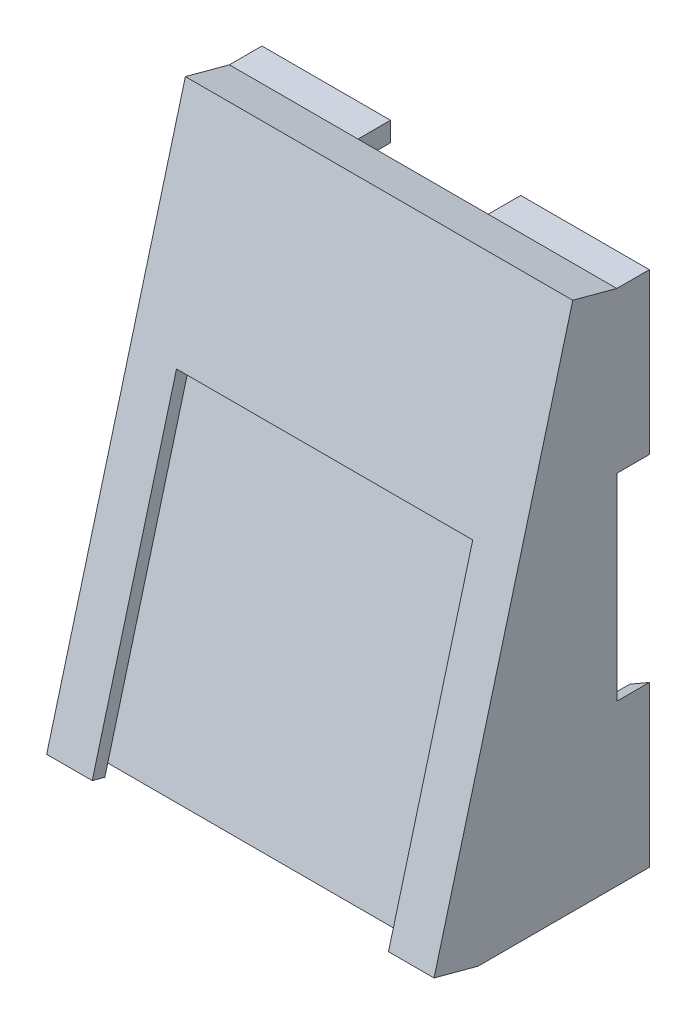
ISO-10303-21;
HEADER;
FILE_DESCRIPTION(('STEP AP214'),'2;1');
FILE_NAME('part.step','',(''),(''),'','','');
FILE_SCHEMA(('AUTOMOTIVE_DESIGN { 1 0 10303 214 1 1 1 1 }'));
ENDSEC;
DATA;
#1=APPLICATION_CONTEXT('core data for automotive mechanical design processes');
#2=APPLICATION_PROTOCOL_DEFINITION('international standard','automotive_design',2000,#1);
#3=PRODUCT_CONTEXT('',#1,'mechanical');
#4=PRODUCT('Part','Part','',(#3));
#5=PRODUCT_RELATED_PRODUCT_CATEGORY('part','',(#4));
#6=PRODUCT_DEFINITION_FORMATION('','',#4);
#7=PRODUCT_DEFINITION_CONTEXT('part definition',#1,'design');
#8=PRODUCT_DEFINITION('design','',#6,#7);
#9=PRODUCT_DEFINITION_SHAPE('','',#8);
#10=(LENGTH_UNIT() NAMED_UNIT(*) SI_UNIT(.MILLI.,.METRE.));
#11=(NAMED_UNIT(*) PLANE_ANGLE_UNIT() SI_UNIT($,.RADIAN.));
#12=(NAMED_UNIT(*) SI_UNIT($,.STERADIAN.) SOLID_ANGLE_UNIT());
#13=UNCERTAINTY_MEASURE_WITH_UNIT(LENGTH_MEASURE(1.E-05),#10,'distance_accuracy_value','');
#14=(GEOMETRIC_REPRESENTATION_CONTEXT(3) GLOBAL_UNCERTAINTY_ASSIGNED_CONTEXT((#13)) GLOBAL_UNIT_ASSIGNED_CONTEXT((#10,
#11,#12)) REPRESENTATION_CONTEXT('',''));
#15=CARTESIAN_POINT('',(0.,0.,0.));
#16=DIRECTION('',(0.,0.,1.));
#17=DIRECTION('',(1.,0.,0.));
#18=AXIS2_PLACEMENT_3D('',#15,#16,#17);
#19=CARTESIAN_POINT('',(59.5,0.,-2.5));
#20=DIRECTION('',(0.,0.,1.));
#21=DIRECTION('',(1.,0.,0.));
#22=AXIS2_PLACEMENT_3D('',#19,#20,#21);
#23=PLANE('',#22);
#24=DIRECTION('',(0.,-1.,0.));
#25=VECTOR('',#24,1.);
#26=CARTESIAN_POINT('',(19.75,0.,-2.5));
#27=LINE('',#26,#25);
#28=CARTESIAN_POINT('',(19.75,-36.75,-2.5));
#29=VERTEX_POINT('',#28);
#30=CARTESIAN_POINT('',(19.75,-39.75,-2.5));
#31=VERTEX_POINT('',#30);
#32=EDGE_CURVE('E276',#29,#31,#27,.T.);
#33=ORIENTED_EDGE('',*,*,#32,.T.);
#34=DIRECTION('',(-1.,0.,0.));
#35=VECTOR('',#34,1.);
#36=CARTESIAN_POINT('',(59.5,-39.75,-2.5));
#37=LINE('',#36,#35);
#38=CARTESIAN_POINT('',(0.,-39.75,-2.5));
#39=VERTEX_POINT('',#38);
#40=EDGE_CURVE('E465',#31,#39,#37,.T.);
#41=ORIENTED_EDGE('',*,*,#40,.T.);
#42=DIRECTION('',(0.,1.,0.));
#43=VECTOR('',#42,1.);
#44=CARTESIAN_POINT('',(0.,0.,-2.5));
#45=LINE('',#44,#43);
#46=CARTESIAN_POINT('',(0.,-15.1554445662277,-2.5));
#47=VERTEX_POINT('',#46);
#48=EDGE_CURVE('E461',#39,#47,#45,.T.);
#49=ORIENTED_EDGE('',*,*,#48,.T.);
#50=DIRECTION('',(0.866025403784439,-0.5,0.));
#51=VECTOR('',#50,1.);
#52=CARTESIAN_POINT('',(-26.25,0.,-2.5));
#53=LINE('',#52,#51);
#54=CARTESIAN_POINT('',(3.,-16.8874953737966,-2.5));
#55=VERTEX_POINT('',#54);
#56=EDGE_CURVE('E297',#47,#55,#53,.T.);
#57=ORIENTED_EDGE('',*,*,#56,.T.);
#58=DIRECTION('',(0.,-1.,0.));
#59=VECTOR('',#58,1.);
#60=CARTESIAN_POINT('',(3.,0.,-2.5));
#61=LINE('',#60,#59);
#62=CARTESIAN_POINT('',(3.,-36.75,-2.5));
#63=VERTEX_POINT('',#62);
#64=EDGE_CURVE('E48',#55,#63,#61,.T.);
#65=ORIENTED_EDGE('',*,*,#64,.T.);
#66=DIRECTION('',(1.,0.,0.));
#67=VECTOR('',#66,1.);
#68=CARTESIAN_POINT('',(59.5,-36.75,-2.5));
#69=LINE('',#68,#67);
#70=EDGE_CURVE('E510',#63,#29,#69,.T.);
#71=ORIENTED_EDGE('',*,*,#70,.T.);
#72=EDGE_LOOP('',(#33,#41,#49,#57,#65,#71));
#73=FACE_BOUND('',#72,.T.);
#74=ADVANCED_FACE('F41',(#73),#23,.F.);
#75=DIRECTION('',(0.,-1.,0.));
#76=VECTOR('',#75,1.);
#77=CARTESIAN_POINT('',(19.75,0.,-2.5));
#78=LINE('',#77,#76);
#79=CARTESIAN_POINT('',(19.75,39.75,-2.5));
#80=VERTEX_POINT('',#79);
#81=CARTESIAN_POINT('',(19.75,36.75,-2.5));
#82=VERTEX_POINT('',#81);
#83=EDGE_CURVE('E301',#80,#82,#78,.T.);
#84=ORIENTED_EDGE('',*,*,#83,.T.);
#85=DIRECTION('',(-1.,0.,0.));
#86=VECTOR('',#85,1.);
#87=CARTESIAN_POINT('',(59.5,36.75,-2.5));
#88=LINE('',#87,#86);
#89=CARTESIAN_POINT('',(3.,36.75,-2.5));
#90=VERTEX_POINT('',#89);
#91=EDGE_CURVE('E502',#82,#90,#88,.T.);
#92=ORIENTED_EDGE('',*,*,#91,.T.);
#93=CARTESIAN_POINT('',(3.,16.8874953737966,-2.5));
#94=VERTEX_POINT('',#93);
#95=EDGE_CURVE('E11',#90,#94,#61,.T.);
#96=ORIENTED_EDGE('',*,*,#95,.T.);
#97=DIRECTION('',(-0.866025403784439,-0.5,0.));
#98=VECTOR('',#97,1.);
#99=CARTESIAN_POINT('',(3.,16.8874953737966,-2.5));
#100=LINE('',#99,#98);
#101=CARTESIAN_POINT('',(0.,15.1554445662277,-2.5));
#102=VERTEX_POINT('',#101);
#103=EDGE_CURVE('E318',#94,#102,#100,.T.);
#104=ORIENTED_EDGE('',*,*,#103,.T.);
#105=CARTESIAN_POINT('',(0.,39.75,-2.5));
#106=VERTEX_POINT('',#105);
#107=EDGE_CURVE('E440',#102,#106,#45,.T.);
#108=ORIENTED_EDGE('',*,*,#107,.T.);
#109=DIRECTION('',(-1.,0.,0.));
#110=VECTOR('',#109,1.);
#111=CARTESIAN_POINT('',(59.5,39.75,-2.5));
#112=LINE('',#111,#110);
#113=EDGE_CURVE('E496',#80,#106,#112,.T.);
#114=ORIENTED_EDGE('',*,*,#113,.F.);
#115=EDGE_LOOP('',(#84,#92,#96,#104,#108,#114));
#116=FACE_BOUND('',#115,.T.);
#117=ADVANCED_FACE('F585',(#116),#23,.F.);
#118=CARTESIAN_POINT('',(56.5,36.75,-2.5));
#119=VERTEX_POINT('',#118);
#120=CARTESIAN_POINT('',(39.75,36.75,-2.5));
#121=VERTEX_POINT('',#120);
#122=EDGE_CURVE('E504',#119,#121,#88,.T.);
#123=ORIENTED_EDGE('',*,*,#122,.T.);
#124=DIRECTION('',(0.,-1.,0.));
#125=VECTOR('',#124,1.);
#126=CARTESIAN_POINT('',(39.75,0.,-2.5));
#127=LINE('',#126,#125);
#128=CARTESIAN_POINT('',(39.75,39.75,-2.5));
#129=VERTEX_POINT('',#128);
#130=EDGE_CURVE('E302',#129,#121,#127,.T.);
#131=ORIENTED_EDGE('',*,*,#130,.F.);
#132=CARTESIAN_POINT('',(59.5,39.75,-2.5));
#133=VERTEX_POINT('',#132);
#134=EDGE_CURVE('E500',#133,#129,#112,.T.);
#135=ORIENTED_EDGE('',*,*,#134,.F.);
#136=DIRECTION('',(0.,1.,0.));
#137=VECTOR('',#136,1.);
#138=CARTESIAN_POINT('',(59.5,0.,-2.5));
#139=LINE('',#138,#137);
#140=CARTESIAN_POINT('',(59.5,15.1554445662277,-2.5));
#141=VERTEX_POINT('',#140);
#142=EDGE_CURVE('E449',#141,#133,#139,.T.);
#143=ORIENTED_EDGE('',*,*,#142,.F.);
#144=DIRECTION('',(0.866025403784439,-0.5,0.));
#145=VECTOR('',#144,1.);
#146=CARTESIAN_POINT('',(56.5,16.8874953737965,-2.5));
#147=LINE('',#146,#145);
#148=CARTESIAN_POINT('',(56.5,16.8874953737965,-2.5));
#149=VERTEX_POINT('',#148);
#150=EDGE_CURVE('E316',#149,#141,#147,.T.);
#151=ORIENTED_EDGE('',*,*,#150,.F.);
#152=DIRECTION('',(0.,-1.,0.));
#153=VECTOR('',#152,1.);
#154=CARTESIAN_POINT('',(56.5,0.,-2.5));
#155=LINE('',#154,#153);
#156=EDGE_CURVE('E501',#119,#149,#155,.T.);
#157=ORIENTED_EDGE('',*,*,#156,.F.);
#158=EDGE_LOOP('',(#123,#131,#135,#143,#151,#157));
#159=FACE_BOUND('',#158,.T.);
#160=ADVANCED_FACE('F539',(#159),#23,.F.);
#161=CARTESIAN_POINT('',(59.5,-39.75,-2.5));
#162=VERTEX_POINT('',#161);
#163=CARTESIAN_POINT('',(39.75,-39.75,-2.5));
#164=VERTEX_POINT('',#163);
#165=EDGE_CURVE('E483',#162,#164,#37,.T.);
#166=ORIENTED_EDGE('',*,*,#165,.T.);
#167=DIRECTION('',(0.,-1.,0.));
#168=VECTOR('',#167,1.);
#169=CARTESIAN_POINT('',(39.75,0.,-2.5));
#170=LINE('',#169,#168);
#171=CARTESIAN_POINT('',(39.75,-36.75,-2.5));
#172=VERTEX_POINT('',#171);
#173=EDGE_CURVE('E310',#172,#164,#170,.T.);
#174=ORIENTED_EDGE('',*,*,#173,.F.);
#175=CARTESIAN_POINT('',(56.5,-36.75,-2.5));
#176=VERTEX_POINT('',#175);
#177=EDGE_CURVE('E282',#172,#176,#69,.T.);
#178=ORIENTED_EDGE('',*,*,#177,.T.);
#179=CARTESIAN_POINT('',(56.5,-16.8874953737966,-2.5));
#180=VERTEX_POINT('',#179);
#181=EDGE_CURVE('E499',#180,#176,#155,.T.);
#182=ORIENTED_EDGE('',*,*,#181,.F.);
#183=DIRECTION('',(-0.866025403784439,-0.5,0.));
#184=VECTOR('',#183,1.);
#185=CARTESIAN_POINT('',(85.75,0.,-2.5));
#186=LINE('',#185,#184);
#187=CARTESIAN_POINT('',(59.5,-15.1554445662277,-2.5));
#188=VERTEX_POINT('',#187);
#189=EDGE_CURVE('E336',#188,#180,#186,.T.);
#190=ORIENTED_EDGE('',*,*,#189,.F.);
#191=EDGE_CURVE('E443',#162,#188,#139,.T.);
#192=ORIENTED_EDGE('',*,*,#191,.F.);
#193=EDGE_LOOP('',(#166,#174,#178,#182,#190,#192));
#194=FACE_BOUND('',#193,.T.);
#195=ADVANCED_FACE('F513',(#194),#23,.F.);
#196=CARTESIAN_POINT('',(59.5,39.75,0.));
#197=DIRECTION('',(0.,-1.,0.));
#198=DIRECTION('',(0.,0.,-1.));
#199=AXIS2_PLACEMENT_3D('',#196,#197,#198);
#200=PLANE('',#199);
#201=DIRECTION('',(0.,0.,-1.));
#202=VECTOR('',#201,1.);
#203=CARTESIAN_POINT('',(19.75,39.75,2.5));
#204=LINE('',#203,#202);
#205=CARTESIAN_POINT('',(19.75,39.75,2.5));
#206=VERTEX_POINT('',#205);
#207=EDGE_CURVE('E300',#206,#80,#204,.T.);
#208=ORIENTED_EDGE('',*,*,#207,.T.);
#209=ORIENTED_EDGE('',*,*,#113,.T.);
#210=DIRECTION('',(0.,0.,1.));
#211=VECTOR('',#210,1.);
#212=CARTESIAN_POINT('',(0.,39.75,0.));
#213=LINE('',#212,#211);
#214=CARTESIAN_POINT('',(0.,39.75,2.5));
#215=VERTEX_POINT('',#214);
#216=EDGE_CURVE('E467',#106,#215,#213,.T.);
#217=ORIENTED_EDGE('',*,*,#216,.T.);
#218=DIRECTION('',(-1.,0.,0.));
#219=VECTOR('',#218,1.);
#220=CARTESIAN_POINT('',(59.5,39.75,2.5));
#221=LINE('',#220,#219);
#222=EDGE_CURVE('E495',#206,#215,#221,.T.);
#223=ORIENTED_EDGE('',*,*,#222,.F.);
#224=EDGE_LOOP('',(#208,#209,#217,#223));
#225=FACE_BOUND('',#224,.T.);
#226=ADVANCED_FACE('F593',(#225),#200,.F.);
#227=CARTESIAN_POINT('',(59.5,-39.75,0.));
#228=DIRECTION('',(0.,-1.,0.));
#229=DIRECTION('',(0.,0.,-1.));
#230=AXIS2_PLACEMENT_3D('',#227,#228,#229);
#231=PLANE('',#230);
#232=ORIENTED_EDGE('',*,*,#40,.F.);
#233=DIRECTION('',(0.,0.,-1.));
#234=VECTOR('',#233,1.);
#235=CARTESIAN_POINT('',(19.75,-39.75,2.5));
#236=LINE('',#235,#234);
#237=CARTESIAN_POINT('',(19.75,-39.75,2.5));
#238=VERTEX_POINT('',#237);
#239=EDGE_CURVE('E283',#238,#31,#236,.T.);
#240=ORIENTED_EDGE('',*,*,#239,.F.);
#241=DIRECTION('',(-1.,0.,0.));
#242=VECTOR('',#241,1.);
#243=CARTESIAN_POINT('',(0.,-39.75,2.5));
#244=LINE('',#243,#242);
#245=CARTESIAN_POINT('',(39.75,-39.75,2.5));
#246=VERTEX_POINT('',#245);
#247=EDGE_CURVE('E269',#246,#238,#244,.T.);
#248=ORIENTED_EDGE('',*,*,#247,.F.);
#249=DIRECTION('',(0.,0.,-1.));
#250=VECTOR('',#249,1.);
#251=CARTESIAN_POINT('',(39.75,-39.75,2.5));
#252=LINE('',#251,#250);
#253=EDGE_CURVE('E266',#246,#164,#252,.T.);
#254=ORIENTED_EDGE('',*,*,#253,.T.);
#255=ORIENTED_EDGE('',*,*,#165,.F.);
#256=DIRECTION('',(0.,0.,1.));
#257=VECTOR('',#256,1.);
#258=CARTESIAN_POINT('',(59.5,-39.75,0.));
#259=LINE('',#258,#257);
#260=CARTESIAN_POINT('',(59.5,-39.7500000000001,23.8019607982743));
#261=VERTEX_POINT('',#260);
#262=EDGE_CURVE('E458',#162,#261,#259,.T.);
#263=ORIENTED_EDGE('',*,*,#262,.T.);
#264=DIRECTION('',(-1.,0.,0.));
#265=VECTOR('',#264,1.);
#266=CARTESIAN_POINT('',(59.5,-39.7500000000001,23.8019607982743));
#267=LINE('',#266,#265);
#268=CARTESIAN_POINT('',(0.,-39.7500000000001,23.8019607982743));
#269=VERTEX_POINT('',#268);
#270=EDGE_CURVE('E482',#261,#269,#267,.T.);
#271=ORIENTED_EDGE('',*,*,#270,.T.);
#272=DIRECTION('',(0.,0.,1.));
#273=VECTOR('',#272,1.);
#274=CARTESIAN_POINT('',(0.,-39.75,0.));
#275=LINE('',#274,#273);
#276=EDGE_CURVE('E479',#39,#269,#275,.T.);
#277=ORIENTED_EDGE('',*,*,#276,.F.);
#278=EDGE_LOOP('',(#232,#240,#248,#254,#255,#263,#271,#277));
#279=FACE_BOUND('',#278,.T.);
#280=ADVANCED_FACE('F556',(#279),#231,.T.);
#281=CARTESIAN_POINT('',(0.,0.,0.));
#282=DIRECTION('',(1.,0.,0.));
#283=DIRECTION('',(0.,0.,-1.));
#284=AXIS2_PLACEMENT_3D('',#281,#282,#283);
#285=PLANE('',#284);
#286=DIRECTION('',(0.,0.,-1.));
#287=VECTOR('',#286,1.);
#288=CARTESIAN_POINT('',(0.,15.1554445662277,0.));
#289=LINE('',#288,#287);
#290=CARTESIAN_POINT('',(0.,15.1554445662277,2.5));
#291=VERTEX_POINT('',#290);
#292=EDGE_CURVE('E365',#291,#102,#289,.T.);
#293=ORIENTED_EDGE('',*,*,#292,.F.);
#294=DIRECTION('',(0.,-1.,0.));
#295=VECTOR('',#294,1.);
#296=CARTESIAN_POINT('',(0.,0.,2.5));
#297=LINE('',#296,#295);
#298=CARTESIAN_POINT('',(0.,-15.1554445662277,2.5));
#299=VERTEX_POINT('',#298);
#300=EDGE_CURVE('E357',#291,#299,#297,.T.);
#301=ORIENTED_EDGE('',*,*,#300,.T.);
#302=DIRECTION('',(0.,0.,1.));
#303=VECTOR('',#302,1.);
#304=CARTESIAN_POINT('',(0.,-15.1554445662277,0.));
#305=LINE('',#304,#303);
#306=EDGE_CURVE('E359',#47,#299,#305,.T.);
#307=ORIENTED_EDGE('',*,*,#306,.F.);
#308=ORIENTED_EDGE('',*,*,#48,.F.);
#309=ORIENTED_EDGE('',*,*,#276,.T.);
#310=DIRECTION('',(0.,0.258819045102522,0.965925826289068));
#311=VECTOR('',#310,1.);
#312=CARTESIAN_POINT('',(0.,-43.0377450997844,11.5319290435438));
#313=LINE('',#312,#311);
#314=CARTESIAN_POINT('',(0.,-37.9382666842824,30.5634415822978));
#315=VERTEX_POINT('',#314);
#316=EDGE_CURVE('E472',#269,#315,#313,.T.);
#317=ORIENTED_EDGE('',*,*,#316,.T.);
#318=DIRECTION('',(0.,0.965925826289068,-0.258819045102521));
#319=VECTOR('',#318,1.);
#320=CARTESIAN_POINT('',(0.,5.09947841550194,19.031512538754));
#321=LINE('',#320,#319);
#322=CARTESIAN_POINT('',(0.,41.5617333157176,9.26148078402347));
#323=VERTEX_POINT('',#322);
#324=EDGE_CURVE('E471',#315,#323,#321,.T.);
#325=ORIENTED_EDGE('',*,*,#324,.T.);
#326=DIRECTION('',(0.,-0.258819045102521,-0.965925826289068));
#327=VECTOR('',#326,1.);
#328=CARTESIAN_POINT('',(0.,36.4622549002157,-9.77003175473054));
#329=LINE('',#328,#327);
#330=EDGE_CURVE('E469',#323,#215,#329,.T.);
#331=ORIENTED_EDGE('',*,*,#330,.T.);
#332=ORIENTED_EDGE('',*,*,#216,.F.);
#333=ORIENTED_EDGE('',*,*,#107,.F.);
#334=EDGE_LOOP('',(#293,#301,#307,#308,#309,#317,#325,#331,#332,#333));
#335=FACE_BOUND('',#334,.T.);
#336=ADVANCED_FACE('F571',(#335),#285,.F.);
#337=CARTESIAN_POINT('',(3.,-36.75,-6.89848078072927));
#338=DIRECTION('',(0.,-1.,0.));
#339=DIRECTION('',(0.,0.,-1.));
#340=AXIS2_PLACEMENT_3D('',#337,#338,#339);
#341=PLANE('',#340);
#342=DIRECTION('',(0.,0.,-1.));
#343=VECTOR('',#342,1.);
#344=CARTESIAN_POINT('',(19.75,-36.75,2.5));
#345=LINE('',#344,#343);
#346=CARTESIAN_POINT('',(19.75,-36.75,2.5));
#347=VERTEX_POINT('',#346);
#348=EDGE_CURVE('E351',#347,#29,#345,.T.);
#349=ORIENTED_EDGE('',*,*,#348,.T.);
#350=ORIENTED_EDGE('',*,*,#70,.F.);
#351=DIRECTION('',(0.,0.,-1.));
#352=VECTOR('',#351,1.);
#353=CARTESIAN_POINT('',(3.,-36.75,-6.89848078072927));
#354=LINE('',#353,#352);
#355=CARTESIAN_POINT('',(3.,-36.75,22.5111446181162));
#356=VERTEX_POINT('',#355);
#357=EDGE_CURVE('E371',#356,#63,#354,.T.);
#358=ORIENTED_EDGE('',*,*,#357,.F.);
#359=DIRECTION('',(1.,0.,0.));
#360=VECTOR('',#359,1.);
#361=CARTESIAN_POINT('',(3.,-36.75,22.5111446181162));
#362=LINE('',#361,#360);
#363=CARTESIAN_POINT('',(56.5,-36.75,22.5111446181162));
#364=VERTEX_POINT('',#363);
#365=EDGE_CURVE('E379',#356,#364,#362,.T.);
#366=ORIENTED_EDGE('',*,*,#365,.T.);
#367=DIRECTION('',(0.,0.,-1.));
#368=VECTOR('',#367,1.);
#369=CARTESIAN_POINT('',(56.5,-36.75,-6.89848078072927));
#370=LINE('',#369,#368);
#371=EDGE_CURVE('E368',#364,#176,#370,.T.);
#372=ORIENTED_EDGE('',*,*,#371,.T.);
#373=ORIENTED_EDGE('',*,*,#177,.F.);
#374=DIRECTION('',(0.,0.,-1.));
#375=VECTOR('',#374,1.);
#376=CARTESIAN_POINT('',(39.75,-36.75,2.5));
#377=LINE('',#376,#375);
#378=CARTESIAN_POINT('',(39.75,-36.75,2.5));
#379=VERTEX_POINT('',#378);
#380=EDGE_CURVE('E265',#379,#172,#377,.T.);
#381=ORIENTED_EDGE('',*,*,#380,.F.);
#382=DIRECTION('',(1.,0.,0.));
#383=VECTOR('',#382,1.);
#384=CARTESIAN_POINT('',(0.,-36.75,2.5));
#385=LINE('',#384,#383);
#386=EDGE_CURVE('E272',#347,#379,#385,.T.);
#387=ORIENTED_EDGE('',*,*,#386,.F.);
#388=EDGE_LOOP('',(#349,#350,#358,#366,#372,#373,#381,#387));
#389=FACE_BOUND('',#388,.T.);
#390=ADVANCED_FACE('F277',(#389),#341,.F.);
#391=CARTESIAN_POINT('',(3.,36.75,2.81687897442924));
#392=DIRECTION('',(0.,1.,0.));
#393=DIRECTION('',(0.,0.,1.));
#394=AXIS2_PLACEMENT_3D('',#391,#392,#393);
#395=PLANE('',#394);
#396=DIRECTION('',(0.,0.,-1.));
#397=VECTOR('',#396,1.);
#398=CARTESIAN_POINT('',(19.75,36.75,2.5));
#399=LINE('',#398,#397);
#400=CARTESIAN_POINT('',(19.75,36.75,2.5));
#401=VERTEX_POINT('',#400);
#402=EDGE_CURVE('E294',#401,#82,#399,.T.);
#403=ORIENTED_EDGE('',*,*,#402,.F.);
#404=DIRECTION('',(-1.,0.,0.));
#405=VECTOR('',#404,1.);
#406=CARTESIAN_POINT('',(0.,36.75,2.5));
#407=LINE('',#406,#405);
#408=CARTESIAN_POINT('',(39.75,36.75,2.5));
#409=VERTEX_POINT('',#408);
#410=EDGE_CURVE('E307',#409,#401,#407,.T.);
#411=ORIENTED_EDGE('',*,*,#410,.F.);
#412=DIRECTION('',(0.,0.,-1.));
#413=VECTOR('',#412,1.);
#414=CARTESIAN_POINT('',(39.75,36.75,2.5));
#415=LINE('',#414,#413);
#416=EDGE_CURVE('E292',#409,#121,#415,.T.);
#417=ORIENTED_EDGE('',*,*,#416,.T.);
#418=ORIENTED_EDGE('',*,*,#122,.F.);
#419=DIRECTION('',(0.,0.,1.));
#420=VECTOR('',#419,1.);
#421=CARTESIAN_POINT('',(56.5,36.75,2.81687897442924));
#422=LINE('',#421,#420);
#423=CARTESIAN_POINT('',(56.5,36.75,2.81687897442924));
#424=VERTEX_POINT('',#423);
#425=EDGE_CURVE('E364',#119,#424,#422,.T.);
#426=ORIENTED_EDGE('',*,*,#425,.T.);
#427=DIRECTION('',(1.,0.,0.));
#428=VECTOR('',#427,1.);
#429=CARTESIAN_POINT('',(3.,36.75,2.81687897442924));
#430=LINE('',#429,#428);
#431=CARTESIAN_POINT('',(3.,36.75,2.81687897442924));
#432=VERTEX_POINT('',#431);
#433=EDGE_CURVE('E372',#432,#424,#430,.T.);
#434=ORIENTED_EDGE('',*,*,#433,.F.);
#435=DIRECTION('',(0.,0.,1.));
#436=VECTOR('',#435,1.);
#437=CARTESIAN_POINT('',(3.,36.75,2.81687897442924));
#438=LINE('',#437,#436);
#439=EDGE_CURVE('E362',#90,#432,#438,.T.);
#440=ORIENTED_EDGE('',*,*,#439,.F.);
#441=ORIENTED_EDGE('',*,*,#91,.F.);
#442=EDGE_LOOP('',(#403,#411,#417,#418,#426,#434,#440,#441));
#443=FACE_BOUND('',#442,.T.);
#444=ADVANCED_FACE('F532',(#443),#395,.F.);
#445=CARTESIAN_POINT('',(3.,0.,0.));
#446=DIRECTION('',(-1.,0.,0.));
#447=DIRECTION('',(0.,0.,1.));
#448=AXIS2_PLACEMENT_3D('',#445,#446,#447);
#449=PLANE('',#448);
#450=DIRECTION('',(0.,0.,-1.));
#451=VECTOR('',#450,1.);
#452=CARTESIAN_POINT('',(3.,16.8874953737966,2.5));
#453=LINE('',#452,#451);
#454=CARTESIAN_POINT('',(3.,16.8874953737966,2.5));
#455=VERTEX_POINT('',#454);
#456=EDGE_CURVE('E317',#455,#94,#453,.T.);
#457=ORIENTED_EDGE('',*,*,#456,.T.);
#458=ORIENTED_EDGE('',*,*,#95,.F.);
#459=ORIENTED_EDGE('',*,*,#439,.T.);
#460=DIRECTION('',(0.,-0.96592582628907,0.258819045102514));
#461=VECTOR('',#460,1.);
#462=CARTESIAN_POINT('',(3.,-36.75,22.5111446181162));
#463=LINE('',#462,#461);
#464=EDGE_CURVE('E370',#432,#356,#463,.T.);
#465=ORIENTED_EDGE('',*,*,#464,.T.);
#466=ORIENTED_EDGE('',*,*,#357,.T.);
#467=ORIENTED_EDGE('',*,*,#64,.F.);
#468=DIRECTION('',(0.,0.,-1.));
#469=VECTOR('',#468,1.);
#470=CARTESIAN_POINT('',(3.,-16.8874953737966,2.5));
#471=LINE('',#470,#469);
#472=CARTESIAN_POINT('',(3.,-16.8874953737966,2.5));
#473=VERTEX_POINT('',#472);
#474=EDGE_CURVE('E312',#473,#55,#471,.T.);
#475=ORIENTED_EDGE('',*,*,#474,.F.);
#476=DIRECTION('',(0.,-1.,0.));
#477=VECTOR('',#476,1.);
#478=CARTESIAN_POINT('',(3.,16.8874953737966,2.5));
#479=LINE('',#478,#477);
#480=EDGE_CURVE('E325',#455,#473,#479,.T.);
#481=ORIENTED_EDGE('',*,*,#480,.F.);
#482=EDGE_LOOP('',(#457,#458,#459,#465,#466,#467,#475,#481));
#483=FACE_BOUND('',#482,.T.);
#484=ADVANCED_FACE('F580',(#483),#449,.F.);
#485=ORIENTED_EDGE('',*,*,#134,.T.);
#486=DIRECTION('',(0.,0.,-1.));
#487=VECTOR('',#486,1.);
#488=CARTESIAN_POINT('',(39.75,39.75,2.5));
#489=LINE('',#488,#487);
#490=CARTESIAN_POINT('',(39.75,39.75,2.5));
#491=VERTEX_POINT('',#490);
#492=EDGE_CURVE('E287',#491,#129,#489,.T.);
#493=ORIENTED_EDGE('',*,*,#492,.F.);
#494=CARTESIAN_POINT('',(59.5,39.75,2.5));
#495=VERTEX_POINT('',#494);
#496=EDGE_CURVE('E491',#495,#491,#221,.T.);
#497=ORIENTED_EDGE('',*,*,#496,.F.);
#498=DIRECTION('',(0.,0.,1.));
#499=VECTOR('',#498,1.);
#500=CARTESIAN_POINT('',(59.5,39.75,0.));
#501=LINE('',#500,#499);
#502=EDGE_CURVE('E450',#133,#495,#501,.T.);
#503=ORIENTED_EDGE('',*,*,#502,.F.);
#504=EDGE_LOOP('',(#485,#493,#497,#503));
#505=FACE_BOUND('',#504,.T.);
#506=ADVANCED_FACE('F604',(#505),#200,.F.);
#507=CARTESIAN_POINT('',(59.5,36.4622549002157,-9.77003175473054));
#508=DIRECTION('',(0.,0.965925826289068,-0.258819045102521));
#509=DIRECTION('',(0.,0.258819045102521,0.965925826289068));
#510=AXIS2_PLACEMENT_3D('',#507,#508,#509);
#511=PLANE('',#510);
#512=ORIENTED_EDGE('',*,*,#330,.F.);
#513=DIRECTION('',(-1.,0.,0.));
#514=VECTOR('',#513,1.);
#515=CARTESIAN_POINT('',(59.5,41.5617333157176,9.26148078402347));
#516=LINE('',#515,#514);
#517=CARTESIAN_POINT('',(59.5,41.5617333157176,9.26148078402347));
#518=VERTEX_POINT('',#517);
#519=EDGE_CURVE('E489',#518,#323,#516,.T.);
#520=ORIENTED_EDGE('',*,*,#519,.F.);
#521=DIRECTION('',(0.,-0.258819045102521,-0.965925826289068));
#522=VECTOR('',#521,1.);
#523=CARTESIAN_POINT('',(59.5,36.4622549002157,-9.77003175473054));
#524=LINE('',#523,#522);
#525=EDGE_CURVE('E448',#518,#495,#524,.T.);
#526=ORIENTED_EDGE('',*,*,#525,.T.);
#527=ORIENTED_EDGE('',*,*,#496,.T.);
#528=DIRECTION('',(1.,0.,0.));
#529=VECTOR('',#528,1.);
#530=CARTESIAN_POINT('',(0.,39.75,2.5));
#531=LINE('',#530,#529);
#532=EDGE_CURVE('E304',#206,#491,#531,.T.);
#533=ORIENTED_EDGE('',*,*,#532,.F.);
#534=ORIENTED_EDGE('',*,*,#222,.T.);
#535=EDGE_LOOP('',(#512,#520,#526,#527,#533,#534));
#536=FACE_BOUND('',#535,.T.);
#537=ADVANCED_FACE('F597',(#536),#511,.T.);
#538=CARTESIAN_POINT('',(59.5,5.09947841550194,19.031512538754));
#539=DIRECTION('',(0.,0.258819045102521,0.965925826289068));
#540=DIRECTION('',(0.,-0.965925826289068,0.258819045102521));
#541=AXIS2_PLACEMENT_3D('',#538,#539,#540);
#542=PLANE('',#541);
#543=DIRECTION('',(0.,-0.965925826289068,0.258819045102522));
#544=VECTOR('',#543,1.);
#545=CARTESIAN_POINT('',(7.,10.358024630171,17.6224893271717));
#546=LINE('',#545,#544);
#547=CARTESIAN_POINT('',(7.,10.358024630171,17.6224893271717));
#548=VERTEX_POINT('',#547);
#549=CARTESIAN_POINT('',(7.,-37.9382666842824,30.5634415822978));
#550=VERTEX_POINT('',#549);
#551=EDGE_CURVE('E399',#548,#550,#546,.T.);
#552=ORIENTED_EDGE('',*,*,#551,.F.);
#553=DIRECTION('',(-1.,0.,0.));
#554=VECTOR('',#553,1.);
#555=CARTESIAN_POINT('',(7.,10.358024630171,17.6224893271717));
#556=LINE('',#555,#554);
#557=CARTESIAN_POINT('',(52.5,10.358024630171,17.6224893271717));
#558=VERTEX_POINT('',#557);
#559=EDGE_CURVE('E393',#558,#548,#556,.T.);
#560=ORIENTED_EDGE('',*,*,#559,.F.);
#561=DIRECTION('',(0.,-0.965925826289068,0.258819045102522));
#562=VECTOR('',#561,1.);
#563=CARTESIAN_POINT('',(52.5,10.358024630171,17.6224893271717));
#564=LINE('',#563,#562);
#565=CARTESIAN_POINT('',(52.5,-37.9382666842824,30.5634415822978));
#566=VERTEX_POINT('',#565);
#567=EDGE_CURVE('E401',#558,#566,#564,.T.);
#568=ORIENTED_EDGE('',*,*,#567,.T.);
#569=DIRECTION('',(-1.,0.,0.));
#570=VECTOR('',#569,1.);
#571=CARTESIAN_POINT('',(59.5,-37.9382666842824,30.5634415822978));
#572=LINE('',#571,#570);
#573=CARTESIAN_POINT('',(59.5,-37.9382666842824,30.5634415822978));
#574=VERTEX_POINT('',#573);
#575=EDGE_CURVE('E487',#574,#566,#572,.T.);
#576=ORIENTED_EDGE('',*,*,#575,.F.);
#577=DIRECTION('',(0.,0.965925826289068,-0.258819045102521));
#578=VECTOR('',#577,1.);
#579=CARTESIAN_POINT('',(59.5,5.09947841550194,19.031512538754));
#580=LINE('',#579,#578);
#581=EDGE_CURVE('E455',#574,#518,#580,.T.);
#582=ORIENTED_EDGE('',*,*,#581,.T.);
#583=ORIENTED_EDGE('',*,*,#519,.T.);
#584=ORIENTED_EDGE('',*,*,#324,.F.);
#585=EDGE_CURVE('E488',#550,#315,#572,.T.);
#586=ORIENTED_EDGE('',*,*,#585,.F.);
#587=EDGE_LOOP('',(#552,#560,#568,#576,#582,#583,#584,#586));
#588=FACE_BOUND('',#587,.T.);
#589=ADVANCED_FACE('F751',(#588),#542,.T.);
#590=CARTESIAN_POINT('',(59.5,-43.0377450997844,11.5319290435438));
#591=DIRECTION('',(0.,-0.965925826289068,0.258819045102522));
#592=DIRECTION('',(0.,-0.258819045102522,-0.965925826289068));
#593=AXIS2_PLACEMENT_3D('',#590,#591,#592);
#594=PLANE('',#593);
#595=DIRECTION('',(0.,-0.258819045102523,-0.965925826289068));
#596=VECTOR('',#595,1.);
#597=CARTESIAN_POINT('',(7.,-37.9382666842824,30.5634415822978));
#598=LINE('',#597,#596);
#599=CARTESIAN_POINT('',(7.,-38.4559047744875,28.6315899297197));
#600=VERTEX_POINT('',#599);
#601=EDGE_CURVE('E385',#550,#600,#598,.T.);
#602=ORIENTED_EDGE('',*,*,#601,.F.);
#603=ORIENTED_EDGE('',*,*,#585,.T.);
#604=ORIENTED_EDGE('',*,*,#316,.F.);
#605=ORIENTED_EDGE('',*,*,#270,.F.);
#606=DIRECTION('',(0.,0.258819045102522,0.965925826289068));
#607=VECTOR('',#606,1.);
#608=CARTESIAN_POINT('',(59.5,-43.0377450997844,11.5319290435438));
#609=LINE('',#608,#607);
#610=EDGE_CURVE('E456',#261,#574,#609,.T.);
#611=ORIENTED_EDGE('',*,*,#610,.T.);
#612=ORIENTED_EDGE('',*,*,#575,.T.);
#613=DIRECTION('',(0.,0.258819045102523,0.965925826289068));
#614=VECTOR('',#613,1.);
#615=CARTESIAN_POINT('',(52.5,-37.9382666842824,30.5634415822978));
#616=LINE('',#615,#614);
#617=CARTESIAN_POINT('',(52.5,-38.4559047744875,28.6315899297197));
#618=VERTEX_POINT('',#617);
#619=EDGE_CURVE('E390',#618,#566,#616,.T.);
#620=ORIENTED_EDGE('',*,*,#619,.F.);
#621=DIRECTION('',(-1.,0.,0.));
#622=VECTOR('',#621,1.);
#623=CARTESIAN_POINT('',(2.,-38.4559047744875,28.6315899297197));
#624=LINE('',#623,#622);
#625=CARTESIAN_POINT('',(57.5,-38.4559047744875,28.6315899297197));
#626=VERTEX_POINT('',#625);
#627=EDGE_CURVE('E413',#626,#618,#624,.T.);
#628=ORIENTED_EDGE('',*,*,#627,.F.);
#629=DIRECTION('',(0.,0.258819045102523,0.965925826289068));
#630=VECTOR('',#629,1.);
#631=CARTESIAN_POINT('',(57.5,-38.4559047744875,28.6315899297197));
#632=LINE('',#631,#630);
#633=CARTESIAN_POINT('',(57.5,-39.232361909795,25.7338124508525));
#634=VERTEX_POINT('',#633);
#635=EDGE_CURVE('E426',#634,#626,#632,.T.);
#636=ORIENTED_EDGE('',*,*,#635,.F.);
#637=DIRECTION('',(1.,0.,0.));
#638=VECTOR('',#637,1.);
#639=CARTESIAN_POINT('',(2.,-39.232361909795,25.7338124508525));
#640=LINE('',#639,#638);
#641=CARTESIAN_POINT('',(2.,-39.232361909795,25.7338124508525));
#642=VERTEX_POINT('',#641);
#643=EDGE_CURVE('E424',#642,#634,#640,.T.);
#644=ORIENTED_EDGE('',*,*,#643,.F.);
#645=DIRECTION('',(0.,-0.258819045102523,-0.965925826289068));
#646=VECTOR('',#645,1.);
#647=CARTESIAN_POINT('',(2.,-38.4559047744875,28.6315899297197));
#648=LINE('',#647,#646);
#649=CARTESIAN_POINT('',(2.,-38.4559047744875,28.6315899297197));
#650=VERTEX_POINT('',#649);
#651=EDGE_CURVE('E405',#650,#642,#648,.T.);
#652=ORIENTED_EDGE('',*,*,#651,.F.);
#653=EDGE_CURVE('E431',#600,#650,#624,.T.);
#654=ORIENTED_EDGE('',*,*,#653,.F.);
#655=EDGE_LOOP('',(#602,#603,#604,#605,#611,#612,#620,#628,#636,#644,#652,#654));
#656=FACE_BOUND('',#655,.T.);
#657=ADVANCED_FACE('F742',(#656),#594,.T.);
#658=CARTESIAN_POINT('',(59.5,0.,0.));
#659=DIRECTION('',(1.,0.,0.));
#660=DIRECTION('',(0.,0.,-1.));
#661=AXIS2_PLACEMENT_3D('',#658,#659,#660);
#662=PLANE('',#661);
#663=DIRECTION('',(0.,0.,1.));
#664=VECTOR('',#663,1.);
#665=CARTESIAN_POINT('',(59.5,15.1554445662277,0.));
#666=LINE('',#665,#664);
#667=CARTESIAN_POINT('',(59.5,15.1554445662277,2.5));
#668=VERTEX_POINT('',#667);
#669=EDGE_CURVE('E354',#141,#668,#666,.T.);
#670=ORIENTED_EDGE('',*,*,#669,.F.);
#671=ORIENTED_EDGE('',*,*,#142,.T.);
#672=ORIENTED_EDGE('',*,*,#502,.T.);
#673=ORIENTED_EDGE('',*,*,#525,.F.);
#674=ORIENTED_EDGE('',*,*,#581,.F.);
#675=ORIENTED_EDGE('',*,*,#610,.F.);
#676=ORIENTED_EDGE('',*,*,#262,.F.);
#677=ORIENTED_EDGE('',*,*,#191,.T.);
#678=DIRECTION('',(0.,0.,-1.));
#679=VECTOR('',#678,1.);
#680=CARTESIAN_POINT('',(59.5,-15.1554445662277,0.));
#681=LINE('',#680,#679);
#682=CARTESIAN_POINT('',(59.5,-15.1554445662277,2.5));
#683=VERTEX_POINT('',#682);
#684=EDGE_CURVE('E355',#683,#188,#681,.T.);
#685=ORIENTED_EDGE('',*,*,#684,.F.);
#686=DIRECTION('',(0.,1.,0.));
#687=VECTOR('',#686,1.);
#688=CARTESIAN_POINT('',(59.5,0.,2.5));
#689=LINE('',#688,#687);
#690=EDGE_CURVE('E348',#683,#668,#689,.T.);
#691=ORIENTED_EDGE('',*,*,#690,.T.);
#692=EDGE_LOOP('',(#670,#671,#672,#673,#674,#675,#676,#677,#685,#691));
#693=FACE_BOUND('',#692,.T.);
#694=ADVANCED_FACE('F543',(#693),#662,.T.);
#695=CARTESIAN_POINT('',(2.,38.818161328638,7.92606632151786));
#696=DIRECTION('',(-1.,0.,0.));
#697=DIRECTION('',(0.,0.,1.));
#698=AXIS2_PLACEMENT_3D('',#695,#696,#697);
#699=PLANE('',#698);
#700=ORIENTED_EDGE('',*,*,#651,.T.);
#701=DIRECTION('',(0.,-0.965925826289068,0.258819045102522));
#702=VECTOR('',#701,1.);
#703=CARTESIAN_POINT('',(2.,38.0417041933304,5.02828884265067));
#704=LINE('',#703,#702);
#705=CARTESIAN_POINT('',(2.,38.0417041933304,5.02828884265067));
#706=VERTEX_POINT('',#705);
#707=EDGE_CURVE('E421',#706,#642,#704,.T.);
#708=ORIENTED_EDGE('',*,*,#707,.F.);
#709=DIRECTION('',(0.,-0.258819045102523,-0.965925826289068));
#710=VECTOR('',#709,1.);
#711=CARTESIAN_POINT('',(2.,38.818161328638,7.92606632151786));
#712=LINE('',#711,#710);
#713=CARTESIAN_POINT('',(2.,38.818161328638,7.92606632151786));
#714=VERTEX_POINT('',#713);
#715=EDGE_CURVE('E407',#714,#706,#712,.T.);
#716=ORIENTED_EDGE('',*,*,#715,.F.);
#717=DIRECTION('',(0.,-0.965925826289068,0.258819045102522));
#718=VECTOR('',#717,1.);
#719=CARTESIAN_POINT('',(2.,38.818161328638,7.92606632151786));
#720=LINE('',#719,#718);
#721=EDGE_CURVE('E432',#714,#650,#720,.T.);
#722=ORIENTED_EDGE('',*,*,#721,.T.);
#723=EDGE_LOOP('',(#700,#708,#716,#722));
#724=FACE_BOUND('',#723,.T.);
#725=ADVANCED_FACE('F741',(#724),#699,.F.);
#726=CARTESIAN_POINT('',(2.,38.818161328638,7.92606632151786));
#727=DIRECTION('',(0.,0.258819045102522,0.965925826289068));
#728=DIRECTION('',(0.,-0.965925826289068,0.258819045102522));
#729=AXIS2_PLACEMENT_3D('',#726,#727,#728);
#730=PLANE('',#729);
#731=DIRECTION('',(1.,0.,0.));
#732=VECTOR('',#731,1.);
#733=CARTESIAN_POINT('',(7.,9.84038653996594,15.6906376745935));
#734=LINE('',#733,#732);
#735=CARTESIAN_POINT('',(7.,9.84038653996593,15.6906376745935));
#736=VERTEX_POINT('',#735);
#737=CARTESIAN_POINT('',(52.5,9.84038653996594,15.6906376745935));
#738=VERTEX_POINT('',#737);
#739=EDGE_CURVE('E386',#736,#738,#734,.T.);
#740=ORIENTED_EDGE('',*,*,#739,.F.);
#741=DIRECTION('',(0.,-0.965925826289068,0.258819045102522));
#742=VECTOR('',#741,1.);
#743=CARTESIAN_POINT('',(7.,9.84038653996594,15.6906376745935));
#744=LINE('',#743,#742);
#745=EDGE_CURVE('E400',#736,#600,#744,.T.);
#746=ORIENTED_EDGE('',*,*,#745,.T.);
#747=ORIENTED_EDGE('',*,*,#653,.T.);
#748=ORIENTED_EDGE('',*,*,#721,.F.);
#749=DIRECTION('',(-1.,0.,0.));
#750=VECTOR('',#749,1.);
#751=CARTESIAN_POINT('',(2.,38.818161328638,7.92606632151786));
#752=LINE('',#751,#750);
#753=CARTESIAN_POINT('',(57.5,38.818161328638,7.92606632151786));
#754=VERTEX_POINT('',#753);
#755=EDGE_CURVE('E419',#754,#714,#752,.T.);
#756=ORIENTED_EDGE('',*,*,#755,.F.);
#757=DIRECTION('',(0.,-0.965925826289068,0.258819045102522));
#758=VECTOR('',#757,1.);
#759=CARTESIAN_POINT('',(57.5,38.818161328638,7.92606632151786));
#760=LINE('',#759,#758);
#761=EDGE_CURVE('E438',#754,#626,#760,.T.);
#762=ORIENTED_EDGE('',*,*,#761,.T.);
#763=ORIENTED_EDGE('',*,*,#627,.T.);
#764=DIRECTION('',(0.,-0.965925826289068,0.258819045102522));
#765=VECTOR('',#764,1.);
#766=CARTESIAN_POINT('',(52.5,9.84038653996594,15.6906376745935));
#767=LINE('',#766,#765);
#768=EDGE_CURVE('E409',#738,#618,#767,.T.);
#769=ORIENTED_EDGE('',*,*,#768,.F.);
#770=EDGE_LOOP('',(#740,#746,#747,#748,#756,#762,#763,#769));
#771=FACE_BOUND('',#770,.T.);
#772=ADVANCED_FACE('F859',(#771),#730,.F.);
#773=CARTESIAN_POINT('',(57.5,38.818161328638,7.92606632151786));
#774=DIRECTION('',(1.,0.,0.));
#775=DIRECTION('',(0.,0.,-1.));
#776=AXIS2_PLACEMENT_3D('',#773,#774,#775);
#777=PLANE('',#776);
#778=ORIENTED_EDGE('',*,*,#635,.T.);
#779=ORIENTED_EDGE('',*,*,#761,.F.);
#780=DIRECTION('',(0.,0.258819045102523,0.965925826289068));
#781=VECTOR('',#780,1.);
#782=CARTESIAN_POINT('',(57.5,38.818161328638,7.92606632151786));
#783=LINE('',#782,#781);
#784=CARTESIAN_POINT('',(57.5,38.0417041933304,5.02828884265067));
#785=VERTEX_POINT('',#784);
#786=EDGE_CURVE('E420',#785,#754,#783,.T.);
#787=ORIENTED_EDGE('',*,*,#786,.F.);
#788=DIRECTION('',(0.,-0.965925826289068,0.258819045102522));
#789=VECTOR('',#788,1.);
#790=CARTESIAN_POINT('',(57.5,38.0417041933304,5.02828884265067));
#791=LINE('',#790,#789);
#792=EDGE_CURVE('E439',#785,#634,#791,.T.);
#793=ORIENTED_EDGE('',*,*,#792,.T.);
#794=EDGE_LOOP('',(#778,#779,#787,#793));
#795=FACE_BOUND('',#794,.T.);
#796=ADVANCED_FACE('F865',(#795),#777,.F.);
#797=CARTESIAN_POINT('',(2.,38.0417041933304,5.02828884265067));
#798=DIRECTION('',(0.,-0.258819045102522,-0.965925826289068));
#799=DIRECTION('',(0.,0.965925826289068,-0.258819045102522));
#800=AXIS2_PLACEMENT_3D('',#797,#798,#799);
#801=PLANE('',#800);
#802=ORIENTED_EDGE('',*,*,#643,.T.);
#803=ORIENTED_EDGE('',*,*,#792,.F.);
#804=DIRECTION('',(1.,0.,0.));
#805=VECTOR('',#804,1.);
#806=CARTESIAN_POINT('',(2.,38.0417041933304,5.02828884265067));
#807=LINE('',#806,#805);
#808=EDGE_CURVE('E414',#706,#785,#807,.T.);
#809=ORIENTED_EDGE('',*,*,#808,.F.);
#810=ORIENTED_EDGE('',*,*,#707,.T.);
#811=EDGE_LOOP('',(#802,#803,#809,#810));
#812=FACE_BOUND('',#811,.T.);
#813=ADVANCED_FACE('F888',(#812),#801,.F.);
#814=CARTESIAN_POINT('',(0.,34.2363210033411,-9.17359456465798));
#815=DIRECTION('',(0.,-0.965925826289068,0.258819045102523));
#816=DIRECTION('',(0.,-0.258819045102523,-0.965925826289068));
#817=AXIS2_PLACEMENT_3D('',#814,#815,#816);
#818=PLANE('',#817);
#819=ORIENTED_EDGE('',*,*,#715,.T.);
#820=ORIENTED_EDGE('',*,*,#808,.T.);
#821=ORIENTED_EDGE('',*,*,#786,.T.);
#822=ORIENTED_EDGE('',*,*,#755,.T.);
#823=EDGE_LOOP('',(#819,#820,#821,#822));
#824=FACE_BOUND('',#823,.T.);
#825=ADVANCED_FACE('F855',(#824),#818,.T.);
#826=CARTESIAN_POINT('',(7.,10.358024630171,17.6224893271717));
#827=DIRECTION('',(-1.,0.,0.));
#828=DIRECTION('',(0.,0.,1.));
#829=AXIS2_PLACEMENT_3D('',#826,#827,#828);
#830=PLANE('',#829);
#831=ORIENTED_EDGE('',*,*,#601,.T.);
#832=ORIENTED_EDGE('',*,*,#745,.F.);
#833=DIRECTION('',(0.,-0.258819045102523,-0.965925826289068));
#834=VECTOR('',#833,1.);
#835=CARTESIAN_POINT('',(7.,10.358024630171,17.6224893271717));
#836=LINE('',#835,#834);
#837=EDGE_CURVE('E383',#548,#736,#836,.T.);
#838=ORIENTED_EDGE('',*,*,#837,.F.);
#839=ORIENTED_EDGE('',*,*,#551,.T.);
#840=EDGE_LOOP('',(#831,#832,#838,#839));
#841=FACE_BOUND('',#840,.T.);
#842=ADVANCED_FACE('F845',(#841),#830,.F.);
#843=CARTESIAN_POINT('',(52.5,10.358024630171,17.6224893271717));
#844=DIRECTION('',(1.,0.,0.));
#845=DIRECTION('',(0.,0.,-1.));
#846=AXIS2_PLACEMENT_3D('',#843,#844,#845);
#847=PLANE('',#846);
#848=ORIENTED_EDGE('',*,*,#619,.T.);
#849=ORIENTED_EDGE('',*,*,#567,.F.);
#850=DIRECTION('',(0.,0.258819045102523,0.965925826289068));
#851=VECTOR('',#850,1.);
#852=CARTESIAN_POINT('',(52.5,10.358024630171,17.6224893271717));
#853=LINE('',#852,#851);
#854=EDGE_CURVE('E391',#738,#558,#853,.T.);
#855=ORIENTED_EDGE('',*,*,#854,.F.);
#856=ORIENTED_EDGE('',*,*,#768,.T.);
#857=EDGE_LOOP('',(#848,#849,#855,#856));
#858=FACE_BOUND('',#857,.T.);
#859=ADVANCED_FACE('F833',(#858),#847,.F.);
#860=CARTESIAN_POINT('',(0.,5.25854621466902,-1.40902321158229));
#861=DIRECTION('',(0.,-0.965925826289068,0.258819045102523));
#862=DIRECTION('',(0.,-0.258819045102523,-0.965925826289068));
#863=AXIS2_PLACEMENT_3D('',#860,#861,#862);
#864=PLANE('',#863);
#865=ORIENTED_EDGE('',*,*,#837,.T.);
#866=ORIENTED_EDGE('',*,*,#739,.T.);
#867=ORIENTED_EDGE('',*,*,#854,.T.);
#868=ORIENTED_EDGE('',*,*,#559,.T.);
#869=EDGE_LOOP('',(#865,#866,#867,#868));
#870=FACE_BOUND('',#869,.T.);
#871=ADVANCED_FACE('F735',(#870),#864,.T.);
#872=CARTESIAN_POINT('',(56.5,0.,0.));
#873=DIRECTION('',(-1.,0.,0.));
#874=DIRECTION('',(0.,0.,1.));
#875=AXIS2_PLACEMENT_3D('',#872,#873,#874);
#876=PLANE('',#875);
#877=DIRECTION('',(0.,0.,-1.));
#878=VECTOR('',#877,1.);
#879=CARTESIAN_POINT('',(56.5,16.8874953737965,2.5));
#880=LINE('',#879,#878);
#881=CARTESIAN_POINT('',(56.5,16.8874953737965,2.5));
#882=VERTEX_POINT('',#881);
#883=EDGE_CURVE('E337',#882,#149,#880,.T.);
#884=ORIENTED_EDGE('',*,*,#883,.F.);
#885=DIRECTION('',(0.,-1.,0.));
#886=VECTOR('',#885,1.);
#887=CARTESIAN_POINT('',(56.5,16.8874953737965,2.5));
#888=LINE('',#887,#886);
#889=CARTESIAN_POINT('',(56.5,-16.8874953737966,2.5));
#890=VERTEX_POINT('',#889);
#891=EDGE_CURVE('E334',#882,#890,#888,.T.);
#892=ORIENTED_EDGE('',*,*,#891,.T.);
#893=DIRECTION('',(0.,0.,-1.));
#894=VECTOR('',#893,1.);
#895=CARTESIAN_POINT('',(56.5,-16.8874953737966,2.5));
#896=LINE('',#895,#894);
#897=EDGE_CURVE('E335',#890,#180,#896,.T.);
#898=ORIENTED_EDGE('',*,*,#897,.T.);
#899=ORIENTED_EDGE('',*,*,#181,.T.);
#900=ORIENTED_EDGE('',*,*,#371,.F.);
#901=DIRECTION('',(0.,-0.96592582628907,0.258819045102514));
#902=VECTOR('',#901,1.);
#903=CARTESIAN_POINT('',(56.5,-36.75,22.5111446181162));
#904=LINE('',#903,#902);
#905=EDGE_CURVE('E376',#424,#364,#904,.T.);
#906=ORIENTED_EDGE('',*,*,#905,.F.);
#907=ORIENTED_EDGE('',*,*,#425,.F.);
#908=ORIENTED_EDGE('',*,*,#156,.T.);
#909=EDGE_LOOP('',(#884,#892,#898,#899,#900,#906,#907,#908));
#910=FACE_BOUND('',#909,.T.);
#911=ADVANCED_FACE('F517',(#910),#876,.T.);
#912=CARTESIAN_POINT('',(3.,-36.75,22.5111446181162));
#913=DIRECTION('',(0.,0.258819045102514,0.96592582628907));
#914=DIRECTION('',(0.,-0.96592582628907,0.258819045102514));
#915=AXIS2_PLACEMENT_3D('',#912,#913,#914);
#916=PLANE('',#915);
#917=ORIENTED_EDGE('',*,*,#905,.T.);
#918=ORIENTED_EDGE('',*,*,#365,.F.);
#919=ORIENTED_EDGE('',*,*,#464,.F.);
#920=ORIENTED_EDGE('',*,*,#433,.T.);
#921=EDGE_LOOP('',(#917,#918,#919,#920));
#922=FACE_BOUND('',#921,.T.);
#923=ADVANCED_FACE('F525',(#922),#916,.F.);
#924=CARTESIAN_POINT('',(56.5,16.8874953737965,2.5));
#925=DIRECTION('',(0.5,0.866025403784439,0.));
#926=DIRECTION('',(-0.866025403784439,0.5,0.));
#927=AXIS2_PLACEMENT_3D('',#924,#925,#926);
#928=PLANE('',#927);
#929=ORIENTED_EDGE('',*,*,#669,.T.);
#930=DIRECTION('',(0.866025403784439,-0.5,0.));
#931=VECTOR('',#930,1.);
#932=CARTESIAN_POINT('',(56.5,16.8874953737965,2.5));
#933=LINE('',#932,#931);
#934=EDGE_CURVE('E338',#882,#668,#933,.T.);
#935=ORIENTED_EDGE('',*,*,#934,.F.);
#936=ORIENTED_EDGE('',*,*,#883,.T.);
#937=ORIENTED_EDGE('',*,*,#150,.T.);
#938=EDGE_LOOP('',(#929,#935,#936,#937));
#939=FACE_BOUND('',#938,.T.);
#940=ADVANCED_FACE('F541',(#939),#928,.F.);
#941=CARTESIAN_POINT('',(85.75,0.,2.5));
#942=DIRECTION('',(0.5,-0.866025403784439,0.));
#943=DIRECTION('',(0.866025403784439,0.5,0.));
#944=AXIS2_PLACEMENT_3D('',#941,#942,#943);
#945=PLANE('',#944);
#946=ORIENTED_EDGE('',*,*,#684,.T.);
#947=ORIENTED_EDGE('',*,*,#189,.T.);
#948=ORIENTED_EDGE('',*,*,#897,.F.);
#949=DIRECTION('',(-0.866025403784439,-0.5,0.));
#950=VECTOR('',#949,1.);
#951=CARTESIAN_POINT('',(85.75,0.,2.5));
#952=LINE('',#951,#950);
#953=EDGE_CURVE('E343',#683,#890,#952,.T.);
#954=ORIENTED_EDGE('',*,*,#953,.F.);
#955=EDGE_LOOP('',(#946,#947,#948,#954));
#956=FACE_BOUND('',#955,.T.);
#957=ADVANCED_FACE('F553',(#956),#945,.F.);
#958=CARTESIAN_POINT('',(0.,0.,2.5));
#959=DIRECTION('',(0.,0.,-1.));
#960=DIRECTION('',(-1.,0.,0.));
#961=AXIS2_PLACEMENT_3D('',#958,#959,#960);
#962=PLANE('',#961);
#963=ORIENTED_EDGE('',*,*,#953,.T.);
#964=ORIENTED_EDGE('',*,*,#891,.F.);
#965=ORIENTED_EDGE('',*,*,#934,.T.);
#966=ORIENTED_EDGE('',*,*,#690,.F.);
#967=EDGE_LOOP('',(#963,#964,#965,#966));
#968=FACE_BOUND('',#967,.T.);
#969=ADVANCED_FACE('F547',(#968),#962,.T.);
#970=CARTESIAN_POINT('',(3.,16.8874953737966,2.5));
#971=DIRECTION('',(0.5,-0.866025403784439,0.));
#972=DIRECTION('',(0.866025403784439,0.5,0.));
#973=AXIS2_PLACEMENT_3D('',#970,#971,#972);
#974=PLANE('',#973);
#975=ORIENTED_EDGE('',*,*,#292,.T.);
#976=ORIENTED_EDGE('',*,*,#103,.F.);
#977=ORIENTED_EDGE('',*,*,#456,.F.);
#978=DIRECTION('',(-0.866025403784439,-0.5,0.));
#979=VECTOR('',#978,1.);
#980=CARTESIAN_POINT('',(3.,16.8874953737966,2.5));
#981=LINE('',#980,#979);
#982=EDGE_CURVE('E314',#455,#291,#981,.T.);
#983=ORIENTED_EDGE('',*,*,#982,.T.);
#984=EDGE_LOOP('',(#975,#976,#977,#983));
#985=FACE_BOUND('',#984,.T.);
#986=ADVANCED_FACE('F660',(#985),#974,.T.);
#987=CARTESIAN_POINT('',(-26.25,0.,2.5));
#988=DIRECTION('',(0.5,0.866025403784439,0.));
#989=DIRECTION('',(-0.866025403784439,0.5,0.));
#990=AXIS2_PLACEMENT_3D('',#987,#988,#989);
#991=PLANE('',#990);
#992=ORIENTED_EDGE('',*,*,#306,.T.);
#993=DIRECTION('',(0.866025403784439,-0.5,0.));
#994=VECTOR('',#993,1.);
#995=CARTESIAN_POINT('',(-26.25,0.,2.5));
#996=LINE('',#995,#994);
#997=EDGE_CURVE('E329',#299,#473,#996,.T.);
#998=ORIENTED_EDGE('',*,*,#997,.T.);
#999=ORIENTED_EDGE('',*,*,#474,.T.);
#1000=ORIENTED_EDGE('',*,*,#56,.F.);
#1001=EDGE_LOOP('',(#992,#998,#999,#1000));
#1002=FACE_BOUND('',#1001,.T.);
#1003=ADVANCED_FACE('F663',(#1002),#991,.T.);
#1004=CARTESIAN_POINT('',(0.,0.,2.5));
#1005=DIRECTION('',(0.,0.,1.));
#1006=DIRECTION('',(1.,0.,0.));
#1007=AXIS2_PLACEMENT_3D('',#1004,#1005,#1006);
#1008=PLANE('',#1007);
#1009=ORIENTED_EDGE('',*,*,#982,.F.);
#1010=ORIENTED_EDGE('',*,*,#480,.T.);
#1011=ORIENTED_EDGE('',*,*,#997,.F.);
#1012=ORIENTED_EDGE('',*,*,#300,.F.);
#1013=EDGE_LOOP('',(#1009,#1010,#1011,#1012));
#1014=FACE_BOUND('',#1013,.T.);
#1015=ADVANCED_FACE('F613',(#1014),#1008,.F.);
#1016=CARTESIAN_POINT('',(19.75,0.,2.5));
#1017=DIRECTION('',(1.,0.,0.));
#1018=DIRECTION('',(0.,0.,-1.));
#1019=AXIS2_PLACEMENT_3D('',#1016,#1017,#1018);
#1020=PLANE('',#1019);
#1021=ORIENTED_EDGE('',*,*,#83,.F.);
#1022=ORIENTED_EDGE('',*,*,#207,.F.);
#1023=DIRECTION('',(0.,-1.,0.));
#1024=VECTOR('',#1023,1.);
#1025=CARTESIAN_POINT('',(19.75,0.,2.5));
#1026=LINE('',#1025,#1024);
#1027=EDGE_CURVE('E293',#206,#401,#1026,.T.);
#1028=ORIENTED_EDGE('',*,*,#1027,.T.);
#1029=ORIENTED_EDGE('',*,*,#402,.T.);
#1030=EDGE_LOOP('',(#1021,#1022,#1028,#1029));
#1031=FACE_BOUND('',#1030,.T.);
#1032=ADVANCED_FACE('F587',(#1031),#1020,.T.);
#1033=CARTESIAN_POINT('',(39.75,0.,2.5));
#1034=DIRECTION('',(1.,0.,0.));
#1035=DIRECTION('',(0.,1.,0.));
#1036=AXIS2_PLACEMENT_3D('',#1033,#1034,#1035);
#1037=PLANE('',#1036);
#1038=ORIENTED_EDGE('',*,*,#130,.T.);
#1039=ORIENTED_EDGE('',*,*,#416,.F.);
#1040=DIRECTION('',(0.,-1.,0.));
#1041=VECTOR('',#1040,1.);
#1042=CARTESIAN_POINT('',(39.75,0.,2.5));
#1043=LINE('',#1042,#1041);
#1044=EDGE_CURVE('E65',#491,#409,#1043,.T.);
#1045=ORIENTED_EDGE('',*,*,#1044,.F.);
#1046=ORIENTED_EDGE('',*,*,#492,.T.);
#1047=EDGE_LOOP('',(#1038,#1039,#1045,#1046));
#1048=FACE_BOUND('',#1047,.T.);
#1049=ADVANCED_FACE('F605',(#1048),#1037,.F.);
#1050=CARTESIAN_POINT('',(0.,0.,2.5));
#1051=DIRECTION('',(0.,0.,-1.));
#1052=DIRECTION('',(-1.,0.,0.));
#1053=AXIS2_PLACEMENT_3D('',#1050,#1051,#1052);
#1054=PLANE('',#1053);
#1055=ORIENTED_EDGE('',*,*,#532,.T.);
#1056=ORIENTED_EDGE('',*,*,#1044,.T.);
#1057=ORIENTED_EDGE('',*,*,#410,.T.);
#1058=ORIENTED_EDGE('',*,*,#1027,.F.);
#1059=EDGE_LOOP('',(#1055,#1056,#1057,#1058));
#1060=FACE_BOUND('',#1059,.T.);
#1061=ADVANCED_FACE('F599',(#1060),#1054,.T.);
#1062=CARTESIAN_POINT('',(19.75,0.,2.5));
#1063=DIRECTION('',(1.,0.,0.));
#1064=DIRECTION('',(0.,0.,-1.));
#1065=AXIS2_PLACEMENT_3D('',#1062,#1063,#1064);
#1066=PLANE('',#1065);
#1067=ORIENTED_EDGE('',*,*,#32,.F.);
#1068=ORIENTED_EDGE('',*,*,#348,.F.);
#1069=DIRECTION('',(0.,-1.,0.));
#1070=VECTOR('',#1069,1.);
#1071=CARTESIAN_POINT('',(19.75,0.,2.5));
#1072=LINE('',#1071,#1070);
#1073=EDGE_CURVE('E54',#347,#238,#1072,.T.);
#1074=ORIENTED_EDGE('',*,*,#1073,.T.);
#1075=ORIENTED_EDGE('',*,*,#239,.T.);
#1076=EDGE_LOOP('',(#1067,#1068,#1074,#1075));
#1077=FACE_BOUND('',#1076,.T.);
#1078=ADVANCED_FACE('F570',(#1077),#1066,.T.);
#1079=CARTESIAN_POINT('',(39.75,0.,2.5));
#1080=DIRECTION('',(1.,0.,0.));
#1081=DIRECTION('',(0.,0.,-1.));
#1082=AXIS2_PLACEMENT_3D('',#1079,#1080,#1081);
#1083=PLANE('',#1082);
#1084=ORIENTED_EDGE('',*,*,#173,.T.);
#1085=ORIENTED_EDGE('',*,*,#253,.F.);
#1086=DIRECTION('',(0.,-1.,0.));
#1087=VECTOR('',#1086,1.);
#1088=CARTESIAN_POINT('',(39.75,0.,2.5));
#1089=LINE('',#1088,#1087);
#1090=EDGE_CURVE('E262',#379,#246,#1089,.T.);
#1091=ORIENTED_EDGE('',*,*,#1090,.F.);
#1092=ORIENTED_EDGE('',*,*,#380,.T.);
#1093=EDGE_LOOP('',(#1084,#1085,#1091,#1092));
#1094=FACE_BOUND('',#1093,.T.);
#1095=ADVANCED_FACE('F264',(#1094),#1083,.F.);
#1096=CARTESIAN_POINT('',(0.,0.,2.5));
#1097=DIRECTION('',(0.,0.,-1.));
#1098=DIRECTION('',(-1.,0.,0.));
#1099=AXIS2_PLACEMENT_3D('',#1096,#1097,#1098);
#1100=PLANE('',#1099);
#1101=ORIENTED_EDGE('',*,*,#386,.T.);
#1102=ORIENTED_EDGE('',*,*,#1090,.T.);
#1103=ORIENTED_EDGE('',*,*,#247,.T.);
#1104=ORIENTED_EDGE('',*,*,#1073,.F.);
#1105=EDGE_LOOP('',(#1101,#1102,#1103,#1104));
#1106=FACE_BOUND('',#1105,.T.);
#1107=ADVANCED_FACE('F274',(#1106),#1100,.T.);
#1108=CLOSED_SHELL('',(#74,#117,#160,#195,#226,#280,#336,#390,#444,#484,#506,#537,#589,#657,
#694,#725,#772,#796,#813,#825,#842,#859,#871,#911,#923,#940,#957,#969,#986,#1003,#1015,#1032,
#1049,#1061,#1078,#1095,#1107));
#1109=MANIFOLD_SOLID_BREP('B2',#1108);
#1110=ADVANCED_BREP_SHAPE_REPRESENTATION('',(#18,#1109),#14);
#1111=SHAPE_DEFINITION_REPRESENTATION(#9,#1110);
ENDSEC;
END-ISO-10303-21;
